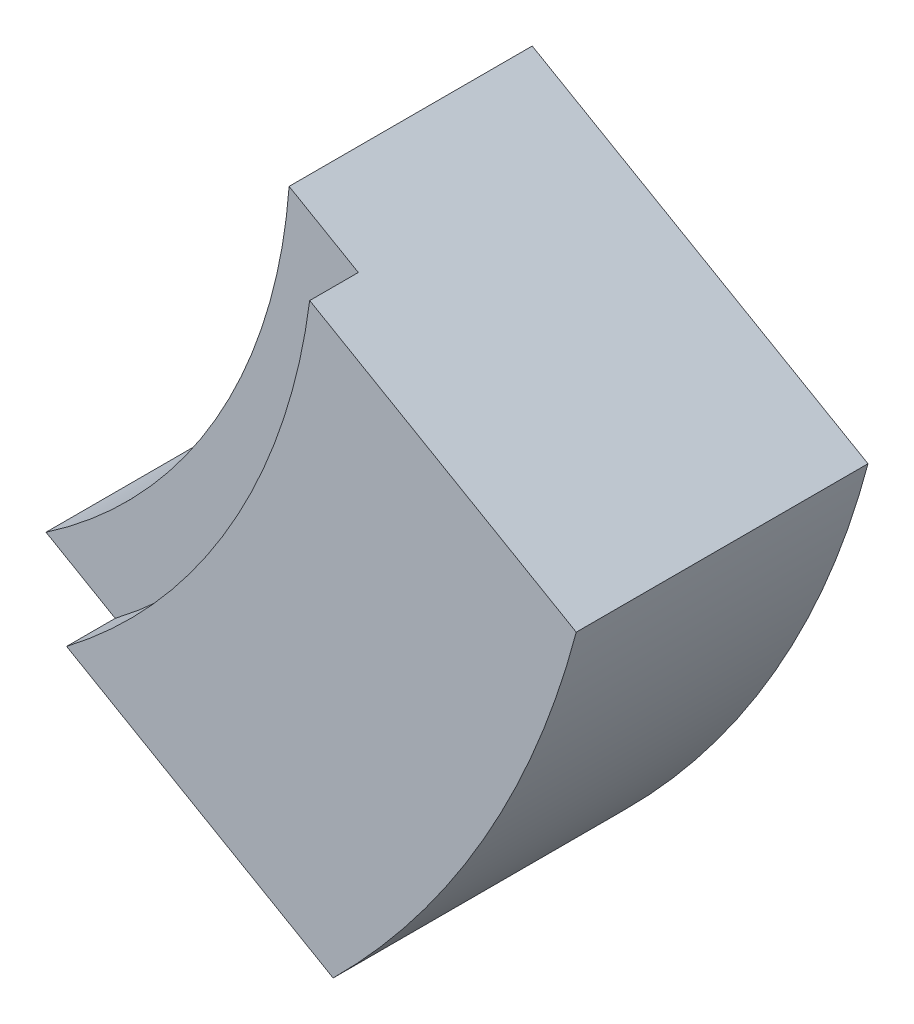
ISO-10303-21;
HEADER;
FILE_DESCRIPTION(('STEP AP214'),'2;1');
FILE_NAME('part.step','',(''),(''),'','','');
FILE_SCHEMA(('AUTOMOTIVE_DESIGN { 1 0 10303 214 1 1 1 1 }'));
ENDSEC;
DATA;
#1=APPLICATION_CONTEXT('core data for automotive mechanical design processes');
#2=APPLICATION_PROTOCOL_DEFINITION('international standard','automotive_design',2000,#1);
#3=PRODUCT_CONTEXT('',#1,'mechanical');
#4=PRODUCT('Part','Part','',(#3));
#5=PRODUCT_RELATED_PRODUCT_CATEGORY('part','',(#4));
#6=PRODUCT_DEFINITION_FORMATION('','',#4);
#7=PRODUCT_DEFINITION_CONTEXT('part definition',#1,'design');
#8=PRODUCT_DEFINITION('design','',#6,#7);
#9=PRODUCT_DEFINITION_SHAPE('','',#8);
#10=(LENGTH_UNIT() NAMED_UNIT(*) SI_UNIT(.MILLI.,.METRE.));
#11=(NAMED_UNIT(*) PLANE_ANGLE_UNIT() SI_UNIT($,.RADIAN.));
#12=(NAMED_UNIT(*) SI_UNIT($,.STERADIAN.) SOLID_ANGLE_UNIT());
#13=UNCERTAINTY_MEASURE_WITH_UNIT(LENGTH_MEASURE(1.E-05),#10,'distance_accuracy_value','');
#14=(GEOMETRIC_REPRESENTATION_CONTEXT(3) GLOBAL_UNCERTAINTY_ASSIGNED_CONTEXT((#13)) GLOBAL_UNIT_ASSIGNED_CONTEXT((#10,
#11,#12)) REPRESENTATION_CONTEXT('',''));
#15=CARTESIAN_POINT('',(0.,0.,0.));
#16=DIRECTION('',(0.,0.,1.));
#17=DIRECTION('',(1.,0.,0.));
#18=AXIS2_PLACEMENT_3D('',#15,#16,#17);
#19=CARTESIAN_POINT('',(0.,0.,25.));
#20=DIRECTION('',(0.,0.,-1.));
#21=DIRECTION('',(0.5,0.866025403784438,0.));
#22=AXIS2_PLACEMENT_3D('',#19,#20,#21);
#23=PLANE('',#22);
#24=CARTESIAN_POINT('',(0.,0.,25.));
#25=DIRECTION('',(0.,0.,-1.));
#26=DIRECTION('',(0.5,0.866025403784438,0.));
#27=AXIS2_PLACEMENT_3D('',#24,#25,#26);
#28=CIRCLE('',#27,64.999999999994);
#29=CARTESIAN_POINT('',(64.4615242270607,-8.34936490538582,25.));
#30=VERTEX_POINT('',#29);
#31=CARTESIAN_POINT('',(39.4615242270607,-51.6506350946077,25.));
#32=VERTEX_POINT('',#31);
#33=EDGE_CURVE('E94',#30,#32,#28,.T.);
#34=ORIENTED_EDGE('',*,*,#33,.F.);
#35=DIRECTION('',(-0.866025403784438,0.5,0.));
#36=VECTOR('',#35,1.);
#37=CARTESIAN_POINT('',(91.8725393319323,-24.1751218549444,25.));
#38=LINE('',#37,#36);
#39=CARTESIAN_POINT('',(57.3434777866245,-4.23975887689571,25.));
#40=VERTEX_POINT('',#39);
#41=EDGE_CURVE('E46',#30,#40,#38,.T.);
#42=ORIENTED_EDGE('',*,*,#41,.T.);
#43=CARTESIAN_POINT('',(0.,0.,25.));
#44=DIRECTION('',(0.,0.,-1.));
#45=DIRECTION('',(-0.5,-0.866025403784438,0.));
#46=AXIS2_PLACEMENT_3D('',#43,#44,#45);
#47=CIRCLE('',#46,57.499999999994);
#48=CARTESIAN_POINT('',(32.3434777866244,-47.5410290661176,25.));
#49=VERTEX_POINT('',#48);
#50=EDGE_CURVE('E82',#40,#49,#47,.T.);
#51=ORIENTED_EDGE('',*,*,#50,.T.);
#52=DIRECTION('',(0.866025403784438,-0.5,0.));
#53=VECTOR('',#52,1.);
#54=CARTESIAN_POINT('',(32.3434777866244,-47.5410290661176,25.));
#55=LINE('',#54,#53);
#56=EDGE_CURVE('E38',#49,#32,#55,.T.);
#57=ORIENTED_EDGE('',*,*,#56,.T.);
#58=EDGE_LOOP('',(#34,#42,#51,#57));
#59=FACE_BOUND('',#58,.T.);
#60=ADVANCED_FACE('F17',(#59),#23,.F.);
#61=CARTESIAN_POINT('',(0.,0.,25.));
#62=DIRECTION('',(0.,0.,-1.));
#63=DIRECTION('',(0.5,0.866025403784438,0.));
#64=AXIS2_PLACEMENT_3D('',#61,#62,#63);
#65=CYLINDRICAL_SURFACE('',#64,57.499999999994);
#66=CARTESIAN_POINT('',(0.,0.,0.));
#67=DIRECTION('',(0.,0.,-1.));
#68=DIRECTION('',(-0.5,-0.866025403784438,0.));
#69=AXIS2_PLACEMENT_3D('',#66,#67,#68);
#70=CIRCLE('',#69,57.499999999994);
#71=CARTESIAN_POINT('',(57.3434777866245,-4.23975887689571,0.));
#72=VERTEX_POINT('',#71);
#73=CARTESIAN_POINT('',(32.3434777866244,-47.5410290661176,0.));
#74=VERTEX_POINT('',#73);
#75=EDGE_CURVE('E88',#72,#74,#70,.T.);
#76=ORIENTED_EDGE('',*,*,#75,.T.);
#77=DIRECTION('',(0.,0.,-1.));
#78=VECTOR('',#77,1.);
#79=CARTESIAN_POINT('',(32.3434777866244,-47.5410290661176,25.));
#80=LINE('',#79,#78);
#81=EDGE_CURVE('E11',#49,#74,#80,.T.);
#82=ORIENTED_EDGE('',*,*,#81,.F.);
#83=ORIENTED_EDGE('',*,*,#50,.F.);
#84=DIRECTION('',(0.,0.,-1.));
#85=VECTOR('',#84,1.);
#86=CARTESIAN_POINT('',(57.3434777866245,-4.23975887689571,25.));
#87=LINE('',#86,#85);
#88=EDGE_CURVE('E73',#40,#72,#87,.T.);
#89=ORIENTED_EDGE('',*,*,#88,.T.);
#90=EDGE_LOOP('',(#76,#82,#83,#89));
#91=FACE_BOUND('',#90,.T.);
#92=ADVANCED_FACE('F19',(#91),#65,.F.);
#93=CARTESIAN_POINT('',(32.3434777866244,-47.5410290661176,25.));
#94=DIRECTION('',(0.5,0.866025403784438,0.));
#95=DIRECTION('',(-0.866025403784438,0.5,0.));
#96=AXIS2_PLACEMENT_3D('',#93,#94,#95);
#97=PLANE('',#96);
#98=DIRECTION('',(0.,0.,-1.));
#99=VECTOR('',#98,1.);
#100=CARTESIAN_POINT('',(66.8725393319323,-67.4763920441663,25.));
#101=LINE('',#100,#99);
#102=CARTESIAN_POINT('',(66.8725393319323,-67.4763920441663,30.));
#103=VERTEX_POINT('',#102);
#104=CARTESIAN_POINT('',(66.8725393319323,-67.4763920441663,0.));
#105=VERTEX_POINT('',#104);
#106=EDGE_CURVE('E26',#103,#105,#101,.T.);
#107=ORIENTED_EDGE('',*,*,#106,.F.);
#108=DIRECTION('',(0.866025403784438,-0.5,0.));
#109=VECTOR('',#108,1.);
#110=CARTESIAN_POINT('',(39.4615242270607,-51.6506350946077,30.));
#111=LINE('',#110,#109);
#112=CARTESIAN_POINT('',(39.4615242270607,-51.6506350946077,30.));
#113=VERTEX_POINT('',#112);
#114=EDGE_CURVE('E138',#113,#103,#111,.T.);
#115=ORIENTED_EDGE('',*,*,#114,.F.);
#116=DIRECTION('',(0.,0.,-1.));
#117=VECTOR('',#116,1.);
#118=CARTESIAN_POINT('',(39.4615242270607,-51.6506350946077,30.));
#119=LINE('',#118,#117);
#120=EDGE_CURVE('E100',#113,#32,#119,.T.);
#121=ORIENTED_EDGE('',*,*,#120,.T.);
#122=ORIENTED_EDGE('',*,*,#56,.F.);
#123=ORIENTED_EDGE('',*,*,#81,.T.);
#124=DIRECTION('',(0.866025403784438,-0.5,0.));
#125=VECTOR('',#124,1.);
#126=CARTESIAN_POINT('',(32.3434777866244,-47.5410290661176,0.));
#127=LINE('',#126,#125);
#128=EDGE_CURVE('E92',#74,#105,#127,.T.);
#129=ORIENTED_EDGE('',*,*,#128,.T.);
#130=EDGE_LOOP('',(#107,#115,#121,#122,#123,#129));
#131=FACE_BOUND('',#130,.T.);
#132=ADVANCED_FACE('F154',(#131),#97,.F.);
#133=CARTESIAN_POINT('',(0.,0.,25.));
#134=DIRECTION('',(0.,0.,-1.));
#135=DIRECTION('',(0.5,0.866025403784438,0.));
#136=AXIS2_PLACEMENT_3D('',#133,#134,#135);
#137=CYLINDRICAL_SURFACE('',#136,94.999999999994);
#138=CARTESIAN_POINT('',(0.,0.,0.));
#139=DIRECTION('',(0.,0.,1.));
#140=DIRECTION('',(-0.5,-0.866025403784438,0.));
#141=AXIS2_PLACEMENT_3D('',#138,#139,#140);
#142=CIRCLE('',#141,94.999999999994);
#143=CARTESIAN_POINT('',(91.8725393319323,-24.1751218549444,0.));
#144=VERTEX_POINT('',#143);
#145=EDGE_CURVE('E83',#105,#144,#142,.T.);
#146=ORIENTED_EDGE('',*,*,#145,.T.);
#147=DIRECTION('',(0.,0.,-1.));
#148=VECTOR('',#147,1.);
#149=CARTESIAN_POINT('',(91.8725393319323,-24.1751218549444,25.));
#150=LINE('',#149,#148);
#151=CARTESIAN_POINT('',(91.8725393319323,-24.1751218549444,30.));
#152=VERTEX_POINT('',#151);
#153=EDGE_CURVE('E77',#152,#144,#150,.T.);
#154=ORIENTED_EDGE('',*,*,#153,.F.);
#155=CARTESIAN_POINT('',(0.,0.,30.));
#156=DIRECTION('',(0.,0.,1.));
#157=DIRECTION('',(-0.5,-0.866025403784438,0.));
#158=AXIS2_PLACEMENT_3D('',#155,#156,#157);
#159=CIRCLE('',#158,94.999999999994);
#160=EDGE_CURVE('E114',#103,#152,#159,.T.);
#161=ORIENTED_EDGE('',*,*,#160,.F.);
#162=ORIENTED_EDGE('',*,*,#106,.T.);
#163=EDGE_LOOP('',(#146,#154,#161,#162));
#164=FACE_BOUND('',#163,.T.);
#165=ADVANCED_FACE('F111',(#164),#137,.T.);
#166=CARTESIAN_POINT('',(91.8725393319323,-24.1751218549444,25.));
#167=DIRECTION('',(-0.5,-0.866025403784438,0.));
#168=DIRECTION('',(0.866025403784438,-0.5,0.));
#169=AXIS2_PLACEMENT_3D('',#166,#167,#168);
#170=PLANE('',#169);
#171=DIRECTION('',(-0.866025403784438,0.5,0.));
#172=VECTOR('',#171,1.);
#173=CARTESIAN_POINT('',(91.8725393319323,-24.1751218549444,0.));
#174=LINE('',#173,#172);
#175=EDGE_CURVE('E70',#144,#72,#174,.T.);
#176=ORIENTED_EDGE('',*,*,#175,.T.);
#177=ORIENTED_EDGE('',*,*,#88,.F.);
#178=ORIENTED_EDGE('',*,*,#41,.F.);
#179=DIRECTION('',(0.,0.,-1.));
#180=VECTOR('',#179,1.);
#181=CARTESIAN_POINT('',(64.4615242270607,-8.34936490538582,30.));
#182=LINE('',#181,#180);
#183=CARTESIAN_POINT('',(64.4615242270607,-8.34936490538582,30.));
#184=VERTEX_POINT('',#183);
#185=EDGE_CURVE('E130',#184,#30,#182,.T.);
#186=ORIENTED_EDGE('',*,*,#185,.F.);
#187=DIRECTION('',(-0.866025403784438,0.5,0.));
#188=VECTOR('',#187,1.);
#189=CARTESIAN_POINT('',(91.8725393319323,-24.1751218549444,30.));
#190=LINE('',#189,#188);
#191=EDGE_CURVE('E134',#152,#184,#190,.T.);
#192=ORIENTED_EDGE('',*,*,#191,.F.);
#193=ORIENTED_EDGE('',*,*,#153,.T.);
#194=EDGE_LOOP('',(#176,#177,#178,#186,#192,#193));
#195=FACE_BOUND('',#194,.T.);
#196=ADVANCED_FACE('F72',(#195),#170,.F.);
#197=CARTESIAN_POINT('',(0.,0.,0.));
#198=DIRECTION('',(0.,0.,-1.));
#199=DIRECTION('',(0.5,0.866025403784438,0.));
#200=AXIS2_PLACEMENT_3D('',#197,#198,#199);
#201=PLANE('',#200);
#202=ORIENTED_EDGE('',*,*,#145,.F.);
#203=ORIENTED_EDGE('',*,*,#128,.F.);
#204=ORIENTED_EDGE('',*,*,#75,.F.);
#205=ORIENTED_EDGE('',*,*,#175,.F.);
#206=EDGE_LOOP('',(#202,#203,#204,#205));
#207=FACE_BOUND('',#206,.T.);
#208=ADVANCED_FACE('F91',(#207),#201,.T.);
#209=CARTESIAN_POINT('',(0.,0.,30.));
#210=DIRECTION('',(0.,0.,-1.));
#211=DIRECTION('',(0.5,0.866025403784438,0.));
#212=AXIS2_PLACEMENT_3D('',#209,#210,#211);
#213=CYLINDRICAL_SURFACE('',#212,64.999999999994);
#214=ORIENTED_EDGE('',*,*,#185,.T.);
#215=ORIENTED_EDGE('',*,*,#33,.T.);
#216=ORIENTED_EDGE('',*,*,#120,.F.);
#217=CARTESIAN_POINT('',(0.,0.,30.));
#218=DIRECTION('',(0.,0.,-1.));
#219=DIRECTION('',(-0.5,-0.866025403784438,0.));
#220=AXIS2_PLACEMENT_3D('',#217,#218,#219);
#221=CIRCLE('',#220,64.999999999994);
#222=EDGE_CURVE('E135',#184,#113,#221,.T.);
#223=ORIENTED_EDGE('',*,*,#222,.F.);
#224=EDGE_LOOP('',(#214,#215,#216,#223));
#225=FACE_BOUND('',#224,.T.);
#226=ADVANCED_FACE('F167',(#225),#213,.F.);
#227=CARTESIAN_POINT('',(0.,0.,30.));
#228=DIRECTION('',(0.,0.,-1.));
#229=DIRECTION('',(0.5,0.866025403784438,0.));
#230=AXIS2_PLACEMENT_3D('',#227,#228,#229);
#231=PLANE('',#230);
#232=ORIENTED_EDGE('',*,*,#222,.T.);
#233=ORIENTED_EDGE('',*,*,#114,.T.);
#234=ORIENTED_EDGE('',*,*,#160,.T.);
#235=ORIENTED_EDGE('',*,*,#191,.T.);
#236=EDGE_LOOP('',(#232,#233,#234,#235));
#237=FACE_BOUND('',#236,.T.);
#238=ADVANCED_FACE('F147',(#237),#231,.F.);
#239=CLOSED_SHELL('',(#60,#92,#132,#165,#196,#208,#226,#238));
#240=MANIFOLD_SOLID_BREP('B1',#239);
#241=ADVANCED_BREP_SHAPE_REPRESENTATION('',(#18,#240),#14);
#242=SHAPE_DEFINITION_REPRESENTATION(#9,#241);
ENDSEC;
END-ISO-10303-21;
